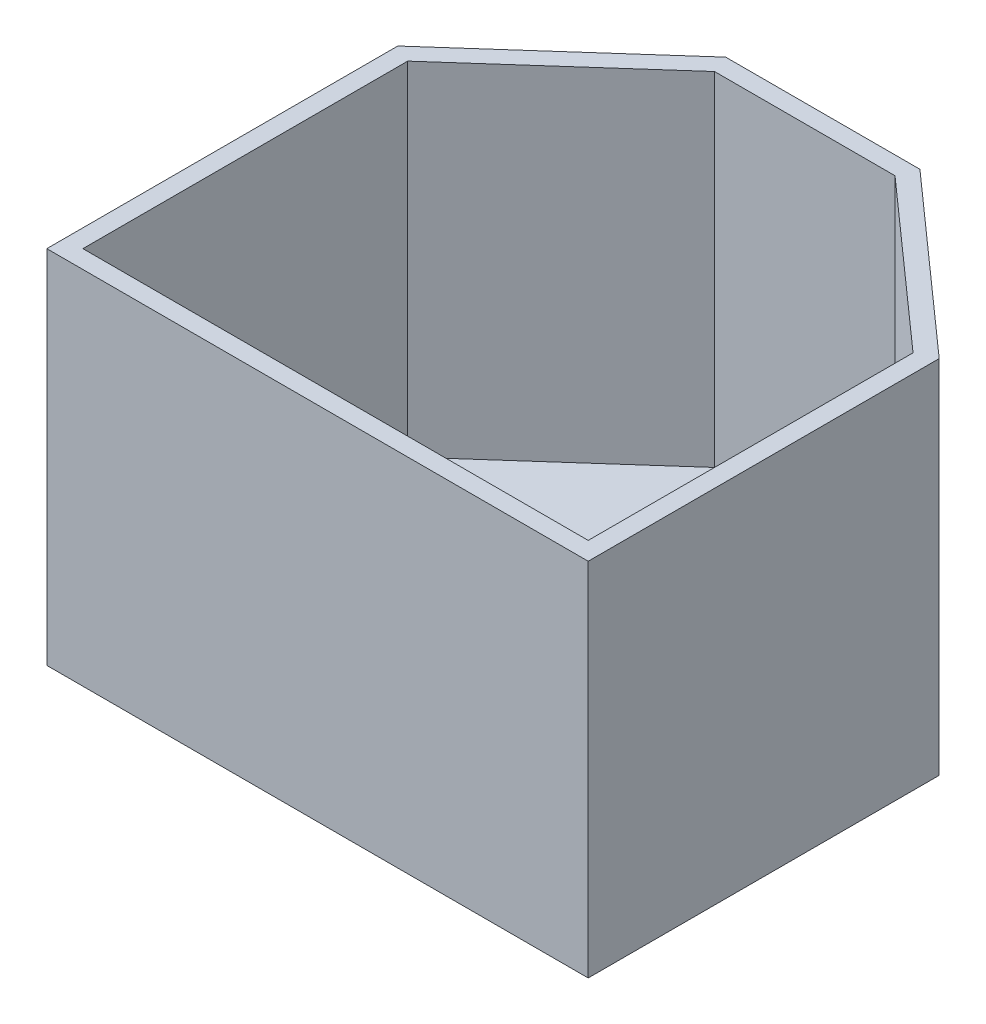
ISO-10303-21;
HEADER;
FILE_DESCRIPTION(('STEP AP214'),'2;1');
FILE_NAME('part.step','',(''),(''),'','','');
FILE_SCHEMA(('AUTOMOTIVE_DESIGN { 1 0 10303 214 1 1 1 1 }'));
ENDSEC;
DATA;
#1=APPLICATION_CONTEXT('core data for automotive mechanical design processes');
#2=APPLICATION_PROTOCOL_DEFINITION('international standard','automotive_design',2000,#1);
#3=PRODUCT_CONTEXT('',#1,'mechanical');
#4=PRODUCT('Part','Part','',(#3));
#5=PRODUCT_RELATED_PRODUCT_CATEGORY('part','',(#4));
#6=PRODUCT_DEFINITION_FORMATION('','',#4);
#7=PRODUCT_DEFINITION_CONTEXT('part definition',#1,'design');
#8=PRODUCT_DEFINITION('design','',#6,#7);
#9=PRODUCT_DEFINITION_SHAPE('','',#8);
#10=(LENGTH_UNIT() NAMED_UNIT(*) SI_UNIT(.MILLI.,.METRE.));
#11=(NAMED_UNIT(*) PLANE_ANGLE_UNIT() SI_UNIT($,.RADIAN.));
#12=(NAMED_UNIT(*) SI_UNIT($,.STERADIAN.) SOLID_ANGLE_UNIT());
#13=UNCERTAINTY_MEASURE_WITH_UNIT(LENGTH_MEASURE(1.E-05),#10,'distance_accuracy_value','');
#14=(GEOMETRIC_REPRESENTATION_CONTEXT(3) GLOBAL_UNCERTAINTY_ASSIGNED_CONTEXT((#13)) GLOBAL_UNIT_ASSIGNED_CONTEXT((#10,
#11,#12)) REPRESENTATION_CONTEXT('',''));
#15=CARTESIAN_POINT('',(0.,0.,0.));
#16=DIRECTION('',(0.,0.,1.));
#17=DIRECTION('',(1.,0.,0.));
#18=AXIS2_PLACEMENT_3D('',#15,#16,#17);
#19=CARTESIAN_POINT('',(0.,25.4,0.));
#20=DIRECTION('',(0.,1.,0.));
#21=DIRECTION('',(0.,0.,1.));
#22=AXIS2_PLACEMENT_3D('',#19,#20,#21);
#23=PLANE('',#22);
#24=DIRECTION('',(1.,0.,0.));
#25=VECTOR('',#24,1.);
#26=CARTESIAN_POINT('',(0.,25.4,-35.56));
#27=LINE('',#26,#25);
#28=CARTESIAN_POINT('',(-13.6657062787666,25.4,-35.56));
#29=VERTEX_POINT('',#28);
#30=CARTESIAN_POINT('',(13.6657062787665,25.4,-35.56));
#31=VERTEX_POINT('',#30);
#32=EDGE_CURVE('E168',#29,#31,#27,.T.);
#33=ORIENTED_EDGE('',*,*,#32,.F.);
#34=DIRECTION('',(-0.74740931868366,0.,0.66436383882992));
#35=VECTOR('',#34,1.);
#36=CARTESIAN_POINT('',(-23.6891393230418,25.4,-26.650281738422));
#37=LINE('',#36,#35);
#38=CARTESIAN_POINT('',(-38.1,25.4,-13.840627803348));
#39=VERTEX_POINT('',#38);
#40=EDGE_CURVE('E185',#29,#39,#37,.T.);
#41=ORIENTED_EDGE('',*,*,#40,.T.);
#42=DIRECTION('',(0.,0.,1.));
#43=VECTOR('',#42,1.);
#44=CARTESIAN_POINT('',(-38.1,25.4,0.));
#45=LINE('',#44,#43);
#46=CARTESIAN_POINT('',(-38.1,25.4,35.56));
#47=VERTEX_POINT('',#46);
#48=EDGE_CURVE('E136',#39,#47,#45,.T.);
#49=ORIENTED_EDGE('',*,*,#48,.T.);
#50=DIRECTION('',(-1.,0.,0.));
#51=VECTOR('',#50,1.);
#52=CARTESIAN_POINT('',(0.,25.4,35.56));
#53=LINE('',#52,#51);
#54=CARTESIAN_POINT('',(38.1,25.4,35.56));
#55=VERTEX_POINT('',#54);
#56=EDGE_CURVE('E118',#55,#47,#53,.T.);
#57=ORIENTED_EDGE('',*,*,#56,.F.);
#58=DIRECTION('',(0.,0.,1.));
#59=VECTOR('',#58,1.);
#60=CARTESIAN_POINT('',(38.1,25.4,0.));
#61=LINE('',#60,#59);
#62=CARTESIAN_POINT('',(38.1,25.4,-13.840627803348));
#63=VERTEX_POINT('',#62);
#64=EDGE_CURVE('E134',#63,#55,#61,.T.);
#65=ORIENTED_EDGE('',*,*,#64,.F.);
#66=DIRECTION('',(0.74740931868366,0.,0.66436383882992));
#67=VECTOR('',#66,1.);
#68=CARTESIAN_POINT('',(23.6891393230418,25.4,-26.650281738422));
#69=LINE('',#68,#67);
#70=EDGE_CURVE('E142',#31,#63,#69,.T.);
#71=ORIENTED_EDGE('',*,*,#70,.F.);
#72=EDGE_LOOP('',(#33,#41,#49,#57,#65,#71));
#73=FACE_BOUND('',#72,.T.);
#74=DIRECTION('',(-0.74740931868366,0.,0.66436383882992));
#75=VECTOR('',#74,1.);
#76=CARTESIAN_POINT('',(-22.0016551724138,25.4,-24.7518620689655));
#77=LINE('',#76,#75);
#78=CARTESIAN_POINT('',(-12.7,25.4,-33.02));
#79=VERTEX_POINT('',#78);
#80=CARTESIAN_POINT('',(-35.56,25.4,-12.7));
#81=VERTEX_POINT('',#80);
#82=EDGE_CURVE('E207',#79,#81,#77,.T.);
#83=ORIENTED_EDGE('',*,*,#82,.F.);
#84=DIRECTION('',(1.,0.,0.));
#85=VECTOR('',#84,1.);
#86=CARTESIAN_POINT('',(0.,25.4,-33.02));
#87=LINE('',#86,#85);
#88=CARTESIAN_POINT('',(12.7,25.4,-33.02));
#89=VERTEX_POINT('',#88);
#90=EDGE_CURVE('E211',#79,#89,#87,.T.);
#91=ORIENTED_EDGE('',*,*,#90,.T.);
#92=DIRECTION('',(0.74740931868366,0.,0.66436383882992));
#93=VECTOR('',#92,1.);
#94=CARTESIAN_POINT('',(22.0016551724138,25.4,-24.7518620689655));
#95=LINE('',#94,#93);
#96=CARTESIAN_POINT('',(35.56,25.4,-12.7));
#97=VERTEX_POINT('',#96);
#98=EDGE_CURVE('E191',#89,#97,#95,.T.);
#99=ORIENTED_EDGE('',*,*,#98,.T.);
#100=DIRECTION('',(0.,0.,1.));
#101=VECTOR('',#100,1.);
#102=CARTESIAN_POINT('',(35.56,25.4,0.));
#103=LINE('',#102,#101);
#104=CARTESIAN_POINT('',(35.56,25.4,33.02));
#105=VERTEX_POINT('',#104);
#106=EDGE_CURVE('E65',#97,#105,#103,.T.);
#107=ORIENTED_EDGE('',*,*,#106,.T.);
#108=DIRECTION('',(-1.,0.,0.));
#109=VECTOR('',#108,1.);
#110=CARTESIAN_POINT('',(0.,25.4,33.02));
#111=LINE('',#110,#109);
#112=CARTESIAN_POINT('',(-35.56,25.4,33.02));
#113=VERTEX_POINT('',#112);
#114=EDGE_CURVE('E199',#105,#113,#111,.T.);
#115=ORIENTED_EDGE('',*,*,#114,.T.);
#116=DIRECTION('',(0.,0.,1.));
#117=VECTOR('',#116,1.);
#118=CARTESIAN_POINT('',(-35.56,25.4,0.));
#119=LINE('',#118,#117);
#120=EDGE_CURVE('E203',#81,#113,#119,.T.);
#121=ORIENTED_EDGE('',*,*,#120,.F.);
#122=EDGE_LOOP('',(#83,#91,#99,#107,#115,#121));
#123=FACE_BOUND('',#122,.T.);
#124=ADVANCED_FACE('F49',(#73,#123),#23,.T.);
#125=CARTESIAN_POINT('',(0.,25.4,-35.56));
#126=DIRECTION('',(0.,0.,-1.));
#127=DIRECTION('',(-1.,0.,0.));
#128=AXIS2_PLACEMENT_3D('',#125,#126,#127);
#129=PLANE('',#128);
#130=DIRECTION('',(1.,0.,0.));
#131=VECTOR('',#130,1.);
#132=CARTESIAN_POINT('',(0.,-25.4,-35.56));
#133=LINE('',#132,#131);
#134=CARTESIAN_POINT('',(-13.6657062787666,-25.4,-35.56));
#135=VERTEX_POINT('',#134);
#136=CARTESIAN_POINT('',(13.6657062787665,-25.4,-35.56));
#137=VERTEX_POINT('',#136);
#138=EDGE_CURVE('E148',#135,#137,#133,.T.);
#139=ORIENTED_EDGE('',*,*,#138,.F.);
#140=DIRECTION('',(0.,-1.,0.));
#141=VECTOR('',#140,1.);
#142=CARTESIAN_POINT('',(-13.6657062787666,25.4,-35.56));
#143=LINE('',#142,#141);
#144=EDGE_CURVE('E11',#29,#135,#143,.T.);
#145=ORIENTED_EDGE('',*,*,#144,.F.);
#146=ORIENTED_EDGE('',*,*,#32,.T.);
#147=DIRECTION('',(0.,-1.,0.));
#148=VECTOR('',#147,1.);
#149=CARTESIAN_POINT('',(13.6657062787665,25.4,-35.56));
#150=LINE('',#149,#148);
#151=EDGE_CURVE('E74',#31,#137,#150,.T.);
#152=ORIENTED_EDGE('',*,*,#151,.T.);
#153=EDGE_LOOP('',(#139,#145,#146,#152));
#154=FACE_BOUND('',#153,.T.);
#155=ADVANCED_FACE('F51',(#154),#129,.T.);
#156=CARTESIAN_POINT('',(-23.6891393230418,25.4,-26.650281738422));
#157=DIRECTION('',(0.66436383882992,0.,0.747409318683659));
#158=DIRECTION('',(0.74740931868366,0.,-0.66436383882992));
#159=AXIS2_PLACEMENT_3D('',#156,#157,#158);
#160=PLANE('',#159);
#161=DIRECTION('',(-0.74740931868366,0.,0.66436383882992));
#162=VECTOR('',#161,1.);
#163=CARTESIAN_POINT('',(-23.6891393230418,-25.4,-26.650281738422));
#164=LINE('',#163,#162);
#165=CARTESIAN_POINT('',(-38.1,-25.4,-13.840627803348));
#166=VERTEX_POINT('',#165);
#167=EDGE_CURVE('E151',#135,#166,#164,.T.);
#168=ORIENTED_EDGE('',*,*,#167,.T.);
#169=DIRECTION('',(0.,-1.,0.));
#170=VECTOR('',#169,1.);
#171=CARTESIAN_POINT('',(-38.1,25.4,-13.840627803348));
#172=LINE('',#171,#170);
#173=EDGE_CURVE('E58',#39,#166,#172,.T.);
#174=ORIENTED_EDGE('',*,*,#173,.F.);
#175=ORIENTED_EDGE('',*,*,#40,.F.);
#176=ORIENTED_EDGE('',*,*,#144,.T.);
#177=EDGE_LOOP('',(#168,#174,#175,#176));
#178=FACE_BOUND('',#177,.T.);
#179=ADVANCED_FACE('F321',(#178),#160,.F.);
#180=CARTESIAN_POINT('',(-38.1,25.4,0.));
#181=DIRECTION('',(1.,0.,0.));
#182=DIRECTION('',(0.,0.,-1.));
#183=AXIS2_PLACEMENT_3D('',#180,#181,#182);
#184=PLANE('',#183);
#185=DIRECTION('',(0.,0.,1.));
#186=VECTOR('',#185,1.);
#187=CARTESIAN_POINT('',(-38.1,-25.4,0.));
#188=LINE('',#187,#186);
#189=CARTESIAN_POINT('',(-38.1,-25.4,35.56));
#190=VERTEX_POINT('',#189);
#191=EDGE_CURVE('E155',#166,#190,#188,.T.);
#192=ORIENTED_EDGE('',*,*,#191,.T.);
#193=DIRECTION('',(0.,-1.,0.));
#194=VECTOR('',#193,1.);
#195=CARTESIAN_POINT('',(-38.1,25.4,35.56));
#196=LINE('',#195,#194);
#197=EDGE_CURVE('E126',#47,#190,#196,.T.);
#198=ORIENTED_EDGE('',*,*,#197,.F.);
#199=ORIENTED_EDGE('',*,*,#48,.F.);
#200=ORIENTED_EDGE('',*,*,#173,.T.);
#201=EDGE_LOOP('',(#192,#198,#199,#200));
#202=FACE_BOUND('',#201,.T.);
#203=ADVANCED_FACE('F179',(#202),#184,.F.);
#204=CARTESIAN_POINT('',(0.,25.4,35.56));
#205=DIRECTION('',(0.,0.,1.));
#206=DIRECTION('',(1.,0.,0.));
#207=AXIS2_PLACEMENT_3D('',#204,#205,#206);
#208=PLANE('',#207);
#209=DIRECTION('',(-1.,0.,0.));
#210=VECTOR('',#209,1.);
#211=CARTESIAN_POINT('',(0.,-25.4,35.56));
#212=LINE('',#211,#210);
#213=CARTESIAN_POINT('',(38.1,-25.4,35.56));
#214=VERTEX_POINT('',#213);
#215=EDGE_CURVE('E120',#214,#190,#212,.T.);
#216=ORIENTED_EDGE('',*,*,#215,.F.);
#217=DIRECTION('',(0.,-1.,0.));
#218=VECTOR('',#217,1.);
#219=CARTESIAN_POINT('',(38.1,25.4,35.56));
#220=LINE('',#219,#218);
#221=EDGE_CURVE('E115',#55,#214,#220,.T.);
#222=ORIENTED_EDGE('',*,*,#221,.F.);
#223=ORIENTED_EDGE('',*,*,#56,.T.);
#224=ORIENTED_EDGE('',*,*,#197,.T.);
#225=EDGE_LOOP('',(#216,#222,#223,#224));
#226=FACE_BOUND('',#225,.T.);
#227=ADVANCED_FACE('F117',(#226),#208,.T.);
#228=CARTESIAN_POINT('',(38.1,25.4,0.));
#229=DIRECTION('',(1.,0.,0.));
#230=DIRECTION('',(0.,0.,-1.));
#231=AXIS2_PLACEMENT_3D('',#228,#229,#230);
#232=PLANE('',#231);
#233=DIRECTION('',(0.,0.,1.));
#234=VECTOR('',#233,1.);
#235=CARTESIAN_POINT('',(38.1,-25.4,0.));
#236=LINE('',#235,#234);
#237=CARTESIAN_POINT('',(38.1,-25.4,-13.840627803348));
#238=VERTEX_POINT('',#237);
#239=EDGE_CURVE('E161',#238,#214,#236,.T.);
#240=ORIENTED_EDGE('',*,*,#239,.F.);
#241=DIRECTION('',(0.,-1.,0.));
#242=VECTOR('',#241,1.);
#243=CARTESIAN_POINT('',(38.1,25.4,-13.840627803348));
#244=LINE('',#243,#242);
#245=EDGE_CURVE('E127',#63,#238,#244,.T.);
#246=ORIENTED_EDGE('',*,*,#245,.F.);
#247=ORIENTED_EDGE('',*,*,#64,.T.);
#248=ORIENTED_EDGE('',*,*,#221,.T.);
#249=EDGE_LOOP('',(#240,#246,#247,#248));
#250=FACE_BOUND('',#249,.T.);
#251=ADVANCED_FACE('F140',(#250),#232,.T.);
#252=CARTESIAN_POINT('',(23.6891393230418,25.4,-26.650281738422));
#253=DIRECTION('',(0.66436383882992,0.,-0.74740931868366));
#254=DIRECTION('',(-0.74740931868366,0.,-0.66436383882992));
#255=AXIS2_PLACEMENT_3D('',#252,#253,#254);
#256=PLANE('',#255);
#257=DIRECTION('',(0.74740931868366,0.,0.66436383882992));
#258=VECTOR('',#257,1.);
#259=CARTESIAN_POINT('',(23.6891393230418,-25.4,-26.650281738422));
#260=LINE('',#259,#258);
#261=EDGE_CURVE('E164',#137,#238,#260,.T.);
#262=ORIENTED_EDGE('',*,*,#261,.F.);
#263=ORIENTED_EDGE('',*,*,#151,.F.);
#264=ORIENTED_EDGE('',*,*,#70,.T.);
#265=ORIENTED_EDGE('',*,*,#245,.T.);
#266=EDGE_LOOP('',(#262,#263,#264,#265));
#267=FACE_BOUND('',#266,.T.);
#268=ADVANCED_FACE('F184',(#267),#256,.T.);
#269=CARTESIAN_POINT('',(0.,-25.4,0.));
#270=DIRECTION('',(0.,1.,0.));
#271=DIRECTION('',(0.,0.,1.));
#272=AXIS2_PLACEMENT_3D('',#269,#270,#271);
#273=PLANE('',#272);
#274=ORIENTED_EDGE('',*,*,#138,.T.);
#275=ORIENTED_EDGE('',*,*,#261,.T.);
#276=ORIENTED_EDGE('',*,*,#239,.T.);
#277=ORIENTED_EDGE('',*,*,#215,.T.);
#278=ORIENTED_EDGE('',*,*,#191,.F.);
#279=ORIENTED_EDGE('',*,*,#167,.F.);
#280=EDGE_LOOP('',(#274,#275,#276,#277,#278,#279));
#281=FACE_BOUND('',#280,.T.);
#282=ADVANCED_FACE('F183',(#281),#273,.F.);
#283=CARTESIAN_POINT('',(0.,25.4,-33.02));
#284=DIRECTION('',(0.,0.,-1.));
#285=DIRECTION('',(-1.,0.,0.));
#286=AXIS2_PLACEMENT_3D('',#283,#284,#285);
#287=PLANE('',#286);
#288=DIRECTION('',(1.,0.,0.));
#289=VECTOR('',#288,1.);
#290=CARTESIAN_POINT('',(0.,-22.86,-33.02));
#291=LINE('',#290,#289);
#292=CARTESIAN_POINT('',(-12.7,-22.86,-33.02));
#293=VERTEX_POINT('',#292);
#294=CARTESIAN_POINT('',(12.7,-22.86,-33.02));
#295=VERTEX_POINT('',#294);
#296=EDGE_CURVE('E250',#293,#295,#291,.T.);
#297=ORIENTED_EDGE('',*,*,#296,.T.);
#298=DIRECTION('',(0.,-1.,0.));
#299=VECTOR('',#298,1.);
#300=CARTESIAN_POINT('',(12.7,25.4,-33.02));
#301=LINE('',#300,#299);
#302=EDGE_CURVE('E196',#89,#295,#301,.T.);
#303=ORIENTED_EDGE('',*,*,#302,.F.);
#304=ORIENTED_EDGE('',*,*,#90,.F.);
#305=DIRECTION('',(0.,-1.,0.));
#306=VECTOR('',#305,1.);
#307=CARTESIAN_POINT('',(-12.7,25.4,-33.02));
#308=LINE('',#307,#306);
#309=EDGE_CURVE('E152',#79,#293,#308,.T.);
#310=ORIENTED_EDGE('',*,*,#309,.T.);
#311=EDGE_LOOP('',(#297,#303,#304,#310));
#312=FACE_BOUND('',#311,.T.);
#313=ADVANCED_FACE('F264',(#312),#287,.F.);
#314=CARTESIAN_POINT('',(-22.0016551724138,25.4,-24.7518620689655));
#315=DIRECTION('',(0.66436383882992,0.,0.747409318683659));
#316=DIRECTION('',(0.74740931868366,0.,-0.66436383882992));
#317=AXIS2_PLACEMENT_3D('',#314,#315,#316);
#318=PLANE('',#317);
#319=DIRECTION('',(-0.74740931868366,0.,0.66436383882992));
#320=VECTOR('',#319,1.);
#321=CARTESIAN_POINT('',(-22.0016551724138,-22.86,-24.7518620689655));
#322=LINE('',#321,#320);
#323=CARTESIAN_POINT('',(-35.56,-22.86,-12.7));
#324=VERTEX_POINT('',#323);
#325=EDGE_CURVE('E243',#293,#324,#322,.T.);
#326=ORIENTED_EDGE('',*,*,#325,.F.);
#327=ORIENTED_EDGE('',*,*,#309,.F.);
#328=ORIENTED_EDGE('',*,*,#82,.T.);
#329=DIRECTION('',(0.,-1.,0.));
#330=VECTOR('',#329,1.);
#331=CARTESIAN_POINT('',(-35.56,25.4,-12.7));
#332=LINE('',#331,#330);
#333=EDGE_CURVE('E239',#81,#324,#332,.T.);
#334=ORIENTED_EDGE('',*,*,#333,.T.);
#335=EDGE_LOOP('',(#326,#327,#328,#334));
#336=FACE_BOUND('',#335,.T.);
#337=ADVANCED_FACE('F299',(#336),#318,.T.);
#338=CARTESIAN_POINT('',(-35.56,25.4,0.));
#339=DIRECTION('',(1.,0.,0.));
#340=DIRECTION('',(0.,0.,-1.));
#341=AXIS2_PLACEMENT_3D('',#338,#339,#340);
#342=PLANE('',#341);
#343=DIRECTION('',(0.,0.,1.));
#344=VECTOR('',#343,1.);
#345=CARTESIAN_POINT('',(-35.56,-22.86,0.));
#346=LINE('',#345,#344);
#347=CARTESIAN_POINT('',(-35.56,-22.86,33.02));
#348=VERTEX_POINT('',#347);
#349=EDGE_CURVE('E235',#324,#348,#346,.T.);
#350=ORIENTED_EDGE('',*,*,#349,.F.);
#351=ORIENTED_EDGE('',*,*,#333,.F.);
#352=ORIENTED_EDGE('',*,*,#120,.T.);
#353=DIRECTION('',(0.,-1.,0.));
#354=VECTOR('',#353,1.);
#355=CARTESIAN_POINT('',(-35.56,25.4,33.02));
#356=LINE('',#355,#354);
#357=EDGE_CURVE('E231',#113,#348,#356,.T.);
#358=ORIENTED_EDGE('',*,*,#357,.T.);
#359=EDGE_LOOP('',(#350,#351,#352,#358));
#360=FACE_BOUND('',#359,.T.);
#361=ADVANCED_FACE('F303',(#360),#342,.T.);
#362=CARTESIAN_POINT('',(0.,25.4,33.02));
#363=DIRECTION('',(0.,0.,1.));
#364=DIRECTION('',(1.,0.,0.));
#365=AXIS2_PLACEMENT_3D('',#362,#363,#364);
#366=PLANE('',#365);
#367=DIRECTION('',(-1.,0.,0.));
#368=VECTOR('',#367,1.);
#369=CARTESIAN_POINT('',(0.,-22.86,33.02));
#370=LINE('',#369,#368);
#371=CARTESIAN_POINT('',(35.56,-22.86,33.02));
#372=VERTEX_POINT('',#371);
#373=EDGE_CURVE('E227',#372,#348,#370,.T.);
#374=ORIENTED_EDGE('',*,*,#373,.T.);
#375=ORIENTED_EDGE('',*,*,#357,.F.);
#376=ORIENTED_EDGE('',*,*,#114,.F.);
#377=DIRECTION('',(0.,-1.,0.));
#378=VECTOR('',#377,1.);
#379=CARTESIAN_POINT('',(35.56,25.4,33.02));
#380=LINE('',#379,#378);
#381=EDGE_CURVE('E223',#105,#372,#380,.T.);
#382=ORIENTED_EDGE('',*,*,#381,.T.);
#383=EDGE_LOOP('',(#374,#375,#376,#382));
#384=FACE_BOUND('',#383,.T.);
#385=ADVANCED_FACE('F294',(#384),#366,.F.);
#386=CARTESIAN_POINT('',(35.56,25.4,0.));
#387=DIRECTION('',(1.,0.,0.));
#388=DIRECTION('',(0.,0.,-1.));
#389=AXIS2_PLACEMENT_3D('',#386,#387,#388);
#390=PLANE('',#389);
#391=DIRECTION('',(0.,0.,1.));
#392=VECTOR('',#391,1.);
#393=CARTESIAN_POINT('',(35.56,-22.86,0.));
#394=LINE('',#393,#392);
#395=CARTESIAN_POINT('',(35.56,-22.86,-12.7));
#396=VERTEX_POINT('',#395);
#397=EDGE_CURVE('E219',#396,#372,#394,.T.);
#398=ORIENTED_EDGE('',*,*,#397,.T.);
#399=ORIENTED_EDGE('',*,*,#381,.F.);
#400=ORIENTED_EDGE('',*,*,#106,.F.);
#401=DIRECTION('',(0.,-1.,0.));
#402=VECTOR('',#401,1.);
#403=CARTESIAN_POINT('',(35.56,25.4,-12.7));
#404=LINE('',#403,#402);
#405=EDGE_CURVE('E220',#97,#396,#404,.T.);
#406=ORIENTED_EDGE('',*,*,#405,.T.);
#407=EDGE_LOOP('',(#398,#399,#400,#406));
#408=FACE_BOUND('',#407,.T.);
#409=ADVANCED_FACE('F291',(#408),#390,.F.);
#410=CARTESIAN_POINT('',(22.0016551724138,25.4,-24.7518620689655));
#411=DIRECTION('',(0.66436383882992,0.,-0.74740931868366));
#412=DIRECTION('',(-0.74740931868366,0.,-0.66436383882992));
#413=AXIS2_PLACEMENT_3D('',#410,#411,#412);
#414=PLANE('',#413);
#415=DIRECTION('',(0.74740931868366,0.,0.66436383882992));
#416=VECTOR('',#415,1.);
#417=CARTESIAN_POINT('',(22.0016551724138,-22.86,-24.7518620689655));
#418=LINE('',#417,#416);
#419=EDGE_CURVE('E215',#295,#396,#418,.T.);
#420=ORIENTED_EDGE('',*,*,#419,.T.);
#421=ORIENTED_EDGE('',*,*,#405,.F.);
#422=ORIENTED_EDGE('',*,*,#98,.F.);
#423=ORIENTED_EDGE('',*,*,#302,.T.);
#424=EDGE_LOOP('',(#420,#421,#422,#423));
#425=FACE_BOUND('',#424,.T.);
#426=ADVANCED_FACE('F278',(#425),#414,.F.);
#427=CARTESIAN_POINT('',(0.,-22.86,0.));
#428=DIRECTION('',(0.,1.,0.));
#429=DIRECTION('',(0.,0.,1.));
#430=AXIS2_PLACEMENT_3D('',#427,#428,#429);
#431=PLANE('',#430);
#432=ORIENTED_EDGE('',*,*,#296,.F.);
#433=ORIENTED_EDGE('',*,*,#325,.T.);
#434=ORIENTED_EDGE('',*,*,#349,.T.);
#435=ORIENTED_EDGE('',*,*,#373,.F.);
#436=ORIENTED_EDGE('',*,*,#397,.F.);
#437=ORIENTED_EDGE('',*,*,#419,.F.);
#438=EDGE_LOOP('',(#432,#433,#434,#435,#436,#437));
#439=FACE_BOUND('',#438,.T.);
#440=ADVANCED_FACE('F275',(#439),#431,.T.);
#441=CLOSED_SHELL('',(#124,#155,#179,#203,#227,#251,#268,#282,#313,#337,#361,#385,#409,#426,#440));
#442=MANIFOLD_SOLID_BREP('B2',#441);
#443=ADVANCED_BREP_SHAPE_REPRESENTATION('',(#18,#442),#14);
#444=SHAPE_DEFINITION_REPRESENTATION(#9,#443);
ENDSEC;
END-ISO-10303-21;
